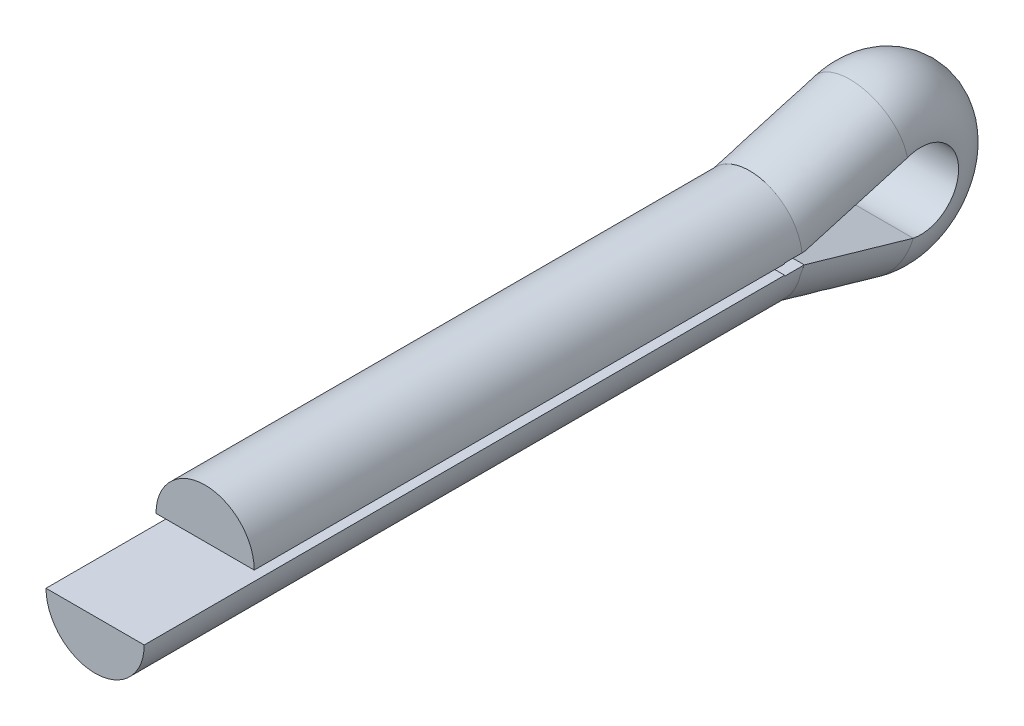
ISO-10303-21;
HEADER;
FILE_DESCRIPTION(('STEP AP214'),'2;1');
FILE_NAME('part.step','',(''),(''),'','','');
FILE_SCHEMA(('AUTOMOTIVE_DESIGN { 1 0 10303 214 1 1 1 1 }'));
ENDSEC;
DATA;
#1=APPLICATION_CONTEXT('core data for automotive mechanical design processes');
#2=APPLICATION_PROTOCOL_DEFINITION('international standard','automotive_design',2000,#1);
#3=PRODUCT_CONTEXT('',#1,'mechanical');
#4=PRODUCT('Part','Part','',(#3));
#5=PRODUCT_RELATED_PRODUCT_CATEGORY('part','',(#4));
#6=PRODUCT_DEFINITION_FORMATION('','',#4);
#7=PRODUCT_DEFINITION_CONTEXT('part definition',#1,'design');
#8=PRODUCT_DEFINITION('design','',#6,#7);
#9=PRODUCT_DEFINITION_SHAPE('','',#8);
#10=(LENGTH_UNIT() NAMED_UNIT(*) SI_UNIT(.MILLI.,.METRE.));
#11=(NAMED_UNIT(*) PLANE_ANGLE_UNIT() SI_UNIT($,.RADIAN.));
#12=(NAMED_UNIT(*) SI_UNIT($,.STERADIAN.) SOLID_ANGLE_UNIT());
#13=UNCERTAINTY_MEASURE_WITH_UNIT(LENGTH_MEASURE(1.E-05),#10,'distance_accuracy_value','');
#14=(GEOMETRIC_REPRESENTATION_CONTEXT(3) GLOBAL_UNCERTAINTY_ASSIGNED_CONTEXT((#13)) GLOBAL_UNIT_ASSIGNED_CONTEXT((#10,
#11,#12)) REPRESENTATION_CONTEXT('',''));
#15=CARTESIAN_POINT('',(0.,0.,0.));
#16=DIRECTION('',(0.,0.,1.));
#17=DIRECTION('',(1.,0.,0.));
#18=AXIS2_PLACEMENT_3D('',#15,#16,#17);
#19=CARTESIAN_POINT('',(2.5,0.25,33.));
#20=DIRECTION('',(0.,0.,-1.));
#21=DIRECTION('',(-1.,0.,0.));
#22=AXIS2_PLACEMENT_3D('',#19,#20,#21);
#23=PLANE('',#22);
#24=CARTESIAN_POINT('',(2.5,0.25,33.));
#25=DIRECTION('',(0.,0.,1.));
#26=DIRECTION('',(-1.,0.,0.));
#27=AXIS2_PLACEMENT_3D('',#24,#25,#26);
#28=CIRCLE('',#27,2.5);
#29=CARTESIAN_POINT('',(5.,0.25,33.));
#30=VERTEX_POINT('',#29);
#31=CARTESIAN_POINT('',(0.,0.25,33.));
#32=VERTEX_POINT('',#31);
#33=EDGE_CURVE('E208',#30,#32,#28,.T.);
#34=ORIENTED_EDGE('',*,*,#33,.T.);
#35=DIRECTION('',(1.,0.,0.));
#36=VECTOR('',#35,1.);
#37=CARTESIAN_POINT('',(5.,0.25,33.));
#38=LINE('',#37,#36);
#39=EDGE_CURVE('E211',#32,#30,#38,.T.);
#40=ORIENTED_EDGE('',*,*,#39,.T.);
#41=EDGE_LOOP('',(#34,#40));
#42=FACE_BOUND('',#41,.T.);
#43=ADVANCED_FACE('F32',(#42),#23,.F.);
#44=CARTESIAN_POINT('',(2.5,-0.25,38.6));
#45=DIRECTION('',(0.,0.,-1.));
#46=DIRECTION('',(-1.,0.,0.));
#47=AXIS2_PLACEMENT_3D('',#44,#45,#46);
#48=PLANE('',#47);
#49=CARTESIAN_POINT('',(2.5,-0.25,38.6));
#50=DIRECTION('',(0.,0.,1.));
#51=DIRECTION('',(-1.,0.,0.));
#52=AXIS2_PLACEMENT_3D('',#49,#50,#51);
#53=CIRCLE('',#52,2.5);
#54=CARTESIAN_POINT('',(0.,-0.25,38.6));
#55=VERTEX_POINT('',#54);
#56=CARTESIAN_POINT('',(5.,-0.25,38.6));
#57=VERTEX_POINT('',#56);
#58=EDGE_CURVE('E196',#55,#57,#53,.T.);
#59=ORIENTED_EDGE('',*,*,#58,.T.);
#60=DIRECTION('',(-1.,0.,0.));
#61=VECTOR('',#60,1.);
#62=CARTESIAN_POINT('',(0.,-0.25,38.6));
#63=LINE('',#62,#61);
#64=EDGE_CURVE('E199',#57,#55,#63,.T.);
#65=ORIENTED_EDGE('',*,*,#64,.T.);
#66=EDGE_LOOP('',(#59,#65));
#67=FACE_BOUND('',#66,.T.);
#68=ADVANCED_FACE('F374',(#67),#48,.F.);
#69=CARTESIAN_POINT('',(0.,-0.00250000000000052,-0.92984556307093));
#70=DIRECTION('',(1.,0.,0.));
#71=DIRECTION('',(0.,0.,-1.));
#72=AXIS2_PLACEMENT_3D('',#69,#70,#71);
#73=CYLINDRICAL_SURFACE('',#72,1.92699345379873);
#74=DIRECTION('',(-1.,0.,0.));
#75=VECTOR('',#74,1.);
#76=CARTESIAN_POINT('',(3.64631078803518E-06,1.80107771620032,-0.251309497258058));
#77=LINE('',#76,#75);
#78=CARTESIAN_POINT('',(4.99999635368921,1.80107771620032,-0.251309497258058));
#79=VERTEX_POINT('',#78);
#80=CARTESIAN_POINT('',(3.64631078803518E-06,1.80107771620032,-0.251309497258058));
#81=VERTEX_POINT('',#80);
#82=EDGE_CURVE('E180',#79,#81,#77,.T.);
#83=ORIENTED_EDGE('',*,*,#82,.T.);
#84=CARTESIAN_POINT('',(3.64631078803518E-06,-0.00250000000000052,-0.92984556307093));
#85=DIRECTION('',(1.,0.,0.));
#86=DIRECTION('',(0.,-0.979876555360371,0.199604449487211));
#87=AXIS2_PLACEMENT_3D('',#84,#85,#86);
#88=CIRCLE('',#87,1.92699345379874);
#89=CARTESIAN_POINT('',(3.64631078803518E-06,-1.89071570771029,-0.545209095559971));
#90=VERTEX_POINT('',#89);
#91=EDGE_CURVE('E190',#90,#81,#88,.T.);
#92=ORIENTED_EDGE('',*,*,#91,.F.);
#93=DIRECTION('',(-1.,0.,0.));
#94=VECTOR('',#93,1.);
#95=CARTESIAN_POINT('',(3.64631078803518E-06,-1.89071570771029,-0.545209095559973));
#96=LINE('',#95,#94);
#97=CARTESIAN_POINT('',(4.99999635368921,-1.89071570771029,-0.545209095559971));
#98=VERTEX_POINT('',#97);
#99=EDGE_CURVE('E188',#98,#90,#96,.T.);
#100=ORIENTED_EDGE('',*,*,#99,.F.);
#101=CARTESIAN_POINT('',(4.99999635368921,-0.00250000000000052,-0.92984556307093));
#102=DIRECTION('',(1.,0.,0.));
#103=DIRECTION('',(0.,-0.979876555360372,0.199604449487211));
#104=AXIS2_PLACEMENT_3D('',#101,#102,#103);
#105=CIRCLE('',#104,1.92699345379873);
#106=EDGE_CURVE('E184',#98,#79,#105,.T.);
#107=ORIENTED_EDGE('',*,*,#106,.T.);
#108=EDGE_LOOP('',(#83,#92,#100,#107));
#109=FACE_BOUND('',#108,.T.);
#110=ADVANCED_FACE('F319',(#109),#73,.F.);
#111=CARTESIAN_POINT('',(0.,-0.249999999999999,5.34225564062762));
#112=DIRECTION('',(0.,-1.,0.));
#113=DIRECTION('',(1.,0.,0.));
#114=AXIS2_PLACEMENT_3D('',#111,#112,#113);
#115=PLANE('',#114);
#116=DIRECTION('',(1.,0.,0.));
#117=VECTOR('',#116,1.);
#118=CARTESIAN_POINT('',(0.,-0.249999999999999,6.));
#119=LINE('',#118,#117);
#120=CARTESIAN_POINT('',(0.,-0.249999999999999,6.));
#121=VERTEX_POINT('',#120);
#122=CARTESIAN_POINT('',(5.,-0.25,6.));
#123=VERTEX_POINT('',#122);
#124=EDGE_CURVE('E11',#121,#123,#119,.T.);
#125=ORIENTED_EDGE('',*,*,#124,.F.);
#126=DIRECTION('',(0.,0.,-1.));
#127=VECTOR('',#126,1.);
#128=CARTESIAN_POINT('',(0.,-0.249999999999999,5.34225564062762));
#129=LINE('',#128,#127);
#130=EDGE_CURVE('E202',#55,#121,#129,.T.);
#131=ORIENTED_EDGE('',*,*,#130,.F.);
#132=ORIENTED_EDGE('',*,*,#64,.F.);
#133=DIRECTION('',(0.,0.,-1.));
#134=VECTOR('',#133,1.);
#135=CARTESIAN_POINT('',(5.,-0.25,5.34225564062762));
#136=LINE('',#135,#134);
#137=EDGE_CURVE('E205',#57,#123,#136,.T.);
#138=ORIENTED_EDGE('',*,*,#137,.T.);
#139=EDGE_LOOP('',(#125,#131,#132,#138));
#140=FACE_BOUND('',#139,.T.);
#141=ADVANCED_FACE('F384',(#140),#115,.F.);
#142=CARTESIAN_POINT('',(2.5,-0.285495836964904,5.01369655478465));
#143=DIRECTION('',(0.,0.37672498224056,0.926325152285012));
#144=DIRECTION('',(0.,-0.926325152285012,0.37672498224056));
#145=AXIS2_PLACEMENT_3D('',#142,#143,#144);
#146=PLANE('',#145);
#147=DIRECTION('',(1.,0.,0.));
#148=VECTOR('',#147,1.);
#149=CARTESIAN_POINT('',(2.5,-0.293791577623972,5.01707032990535));
#150=LINE('',#149,#148);
#151=CARTESIAN_POINT('',(1.65391023472169E-05,-0.293791577623972,5.01707032990535));
#152=VERTEX_POINT('',#151);
#153=CARTESIAN_POINT('',(0.000383569879330858,-0.293791577623972,5.01707032990535));
#154=VERTEX_POINT('',#153);
#155=EDGE_CURVE('E41',#152,#154,#150,.T.);
#156=ORIENTED_EDGE('',*,*,#155,.F.);
#157=CARTESIAN_POINT('',(2.5,-0.285495836964904,5.01369655478465));
#158=DIRECTION('',(0.,0.37672498224056,0.926325152285012));
#159=DIRECTION('',(-1.,0.,0.));
#160=AXIS2_PLACEMENT_3D('',#157,#158,#159);
#161=ELLIPSE('',#160,2.5,2.46201938253052);
#162=CARTESIAN_POINT('',(0.0329445270113847,-0.654521066446691,5.1637745513498));
#163=VERTEX_POINT('',#162);
#164=EDGE_CURVE('E302',#152,#163,#161,.T.);
#165=ORIENTED_EDGE('',*,*,#164,.T.);
#166=CARTESIAN_POINT('',(2.5,-0.25,4.99926083691902));
#167=DIRECTION('',(0.,0.37672498224056,0.926325152285012));
#168=DIRECTION('',(0.,0.926325152285012,-0.37672498224056));
#169=AXIS2_PLACEMENT_3D('',#166,#167,#168);
#170=ELLIPSE('',#169,2.69883635765814,2.5);
#171=EDGE_CURVE('E225',#154,#163,#170,.T.);
#172=ORIENTED_EDGE('',*,*,#171,.F.);
#173=EDGE_LOOP('',(#156,#165,#172));
#174=FACE_BOUND('',#173,.T.);
#175=ADVANCED_FACE('F251',(#174),#146,.T.);
#176=CARTESIAN_POINT('',(3.64631078803024E-06,-0.289391008613093,5.01528067291678));
#177=CARTESIAN_POINT('',(3.64631078803024E-06,-1.89071570771029,-0.545209095559975));
#178=CARTESIAN_POINT('',(0.0085142443796971,-4.8351110612692,6.86396879488255));
#179=CARTESIAN_POINT('',(0.0085142443796971,-6.4364357603664,1.30347902640579));
#180=CARTESIAN_POINT('',(4.99148575562031,-4.8351110612692,6.86396879488255));
#181=CARTESIAN_POINT('',(4.99148575562031,-6.4364357603664,1.30347902640579));
#182=CARTESIAN_POINT('',(4.99999635368921,-0.289391008613092,5.01528067291678));
#183=CARTESIAN_POINT('',(4.99999635368921,-1.89071570771029,-0.545209095559975));
#184=(BOUNDED_SURFACE() B_SPLINE_SURFACE(3,1,((#176,#177),(#178,#179),(#180,#181),(#182,#183)),
.UNSPECIFIED.,.F.,.F.,.F.) B_SPLINE_SURFACE_WITH_KNOTS((4,4),(2,2),(0.,1.),(0.,1.),
.UNSPECIFIED.) GEOMETRIC_REPRESENTATION_ITEM() RATIONAL_B_SPLINE_SURFACE(((1.,1.),
(0.334471957552464,0.334471957552464),(0.334471957552464,0.334471957552464),(1.,1.))) REPRESENTATION_ITEM('') SURFACE());
#185=CARTESIAN_POINT('',(1.65391023470866E-05,-0.293791577623971,5.01707032990535));
#186=CARTESIAN_POINT('',(1.22415051607345E-05,-0.293791577623971,5.0113802199369));
#187=CARTESIAN_POINT('',(7.94390797438236E-06,-0.293791577623971,5.00569010996845));
#188=CARTESIAN_POINT('',(3.64631078803024E-06,-0.293791577623971,5.));
#189=B_SPLINE_CURVE_WITH_KNOTS('',3,(#185,#186,#187,#188),.UNSPECIFIED.,.F.,.F.,(4,4),(0.,
0.0170703347741464),.UNSPECIFIED.);
#190=CARTESIAN_POINT('',(3.64631078803024E-06,-0.293791577623972,5.));
#191=VERTEX_POINT('',#190);
#192=EDGE_CURVE('E56',#152,#191,#189,.T.);
#193=DIRECTION('',(0.,-0.276735808007553,-0.960946040403105));
#194=VECTOR('',#193,1.);
#195=CARTESIAN_POINT('',(3.64631078803518E-06,-0.289391008613092,5.01528067291678));
#196=LINE('',#195,#194);
#197=EDGE_CURVE('E304',#191,#90,#196,.T.);
#198=CARTESIAN_POINT('',(2.5,-1.8868205360621,-0.546793213692108));
#199=DIRECTION('',(0.,0.37672498224056,0.926325152285012));
#200=DIRECTION('',(-1.,0.,0.));
#201=AXIS2_PLACEMENT_3D('',#198,#199,#200);
#202=ELLIPSE('',#201,2.5,2.46201938253052);
#203=EDGE_CURVE('E306',#90,#98,#202,.T.);
#204=DIRECTION('',(0.,-0.276735808007553,-0.960946040403105));
#205=VECTOR('',#204,1.);
#206=CARTESIAN_POINT('',(4.99999635368921,-0.289391008613092,5.01528067291678));
#207=LINE('',#206,#205);
#208=CARTESIAN_POINT('',(4.99999635368921,-0.293791577623972,5.));
#209=VERTEX_POINT('',#208);
#210=EDGE_CURVE('E191',#209,#98,#207,.T.);
#211=CARTESIAN_POINT('',(4.99999635368921,-0.293791577623972,5.));
#212=CARTESIAN_POINT('',(4.99999205609203,-0.293791577623972,5.00569010996845));
#213=CARTESIAN_POINT('',(4.99998775849484,-0.293791577623972,5.0113802199369));
#214=CARTESIAN_POINT('',(4.99998346089765,-0.293791577623972,5.01707032990535));
#215=B_SPLINE_CURVE_WITH_KNOTS('',3,(#211,#212,#213,#214),.UNSPECIFIED.,.F.,.F.,(4,4),(0.,
0.0170703347741524),.UNSPECIFIED.);
#216=CARTESIAN_POINT('',(4.99998346089765,-0.293791577623972,5.01707032990535));
#217=VERTEX_POINT('',#216);
#218=EDGE_CURVE('E283',#209,#217,#215,.T.);
#219=CARTESIAN_POINT('',(4.96705547297769,-0.654521066510559,5.16377455137577));
#220=VERTEX_POINT('',#219);
#221=EDGE_CURVE('E305',#220,#217,#161,.T.);
#222=CARTESIAN_POINT('',(4.96705547297769,-0.654521066510559,5.16377455137577));
#223=CARTESIAN_POINT('',(4.95567241823373,-0.723984114533118,5.16838019162372));
#224=CARTESIAN_POINT('',(4.94134276240962,-0.792963031017594,5.17295373257438));
#225=CARTESIAN_POINT('',(4.90692029657588,-0.929471143715911,5.18200469310625));
#226=CARTESIAN_POINT('',(4.88682771998184,-0.997000398526363,5.1864821165726));
#227=CARTESIAN_POINT('',(4.84102284634058,-1.1300918006837,5.19530653707777));
#228=CARTESIAN_POINT('',(4.81531407197679,-1.1956551519311,5.19965361393962));
#229=CARTESIAN_POINT('',(4.75846830274177,-1.32437326086863,5.20818806983407));
#230=CARTESIAN_POINT('',(4.72733138307606,-1.38752805191396,5.21237545107824));
#231=CARTESIAN_POINT('',(4.62604201135939,-1.57276610970813,5.22465737543485));
#232=CARTESIAN_POINT('',(4.54799320351442,-1.69067447994353,5.23247510841774));
#233=CARTESIAN_POINT('',(4.37319527105292,-1.91162804159334,5.24712509414793));
#234=CARTESIAN_POINT('',(4.2764502683548,-2.01467650041891,5.25395756353592));
#235=CARTESIAN_POINT('',(4.06708980713622,-2.20294906343133,5.26644068596328));
#236=CARTESIAN_POINT('',(3.95449590912986,-2.28819699818291,5.2720929190515));
#237=CARTESIAN_POINT('',(3.71652246377559,-2.43858201816375,5.28206396629728));
#238=CARTESIAN_POINT('',(3.59114108779508,-2.50371622171361,5.28638258938952));
#239=CARTESIAN_POINT('',(3.33145952698625,-2.61186683669086,5.2935533494209));
#240=CARTESIAN_POINT('',(3.19717938782545,-2.65493117105062,5.2964086638163));
#241=CARTESIAN_POINT('',(2.92327719488159,-2.71790958635169,5.30058435069096));
#242=CARTESIAN_POINT('',(2.78365552081988,-2.73782530974449,5.30190483207045));
#243=CARTESIAN_POINT('',(2.50327963711892,-2.75393472283625,5.30297294190525));
#244=CARTESIAN_POINT('',(2.36252749973498,-2.75016485216041,5.30272298643381));
#245=CARTESIAN_POINT('',(2.08358415799827,-2.71906121466856,5.3006607076329));
#246=CARTESIAN_POINT('',(1.94539300006523,-2.69172702115678,5.29884835601202));
#247=CARTESIAN_POINT('',(1.74317517549754,-2.63372781614348,5.29500280801013));
#248=CARTESIAN_POINT('',(1.67659108019728,-2.61155075452791,5.29353239207993));
#249=CARTESIAN_POINT('',(1.54552715224032,-2.56168542868084,5.29022614841642));
#250=CARTESIAN_POINT('',(1.48104683938915,-2.53399843249715,5.28839040475907));
#251=CARTESIAN_POINT('',(1.35467738085909,-2.4733189902773,5.2843671477569));
#252=CARTESIAN_POINT('',(1.29278718657798,-2.44032871796455,5.28217977853747));
#253=CARTESIAN_POINT('',(1.1719585397037,-2.36925197887974,5.27746714476811));
#254=CARTESIAN_POINT('',(1.11302296887799,-2.3311606648234,5.27494155882646));
#255=CARTESIAN_POINT('',(0.941304217477466,-2.20961834223705,5.2668828822487));
#256=CARTESIAN_POINT('',(0.833578476131577,-2.11888426132675,5.26086689873178));
#257=CARTESIAN_POINT('',(0.634913667593598,-1.92067111485626,5.24772468119815));
#258=CARTESIAN_POINT('',(0.543974306303606,-1.81319234272443,5.24059846663674));
#259=CARTESIAN_POINT('',(0.421967668924477,-1.64167050474795,5.22922597519885));
#260=CARTESIAN_POINT('',(0.38363723267911,-1.58265123496358,5.22531279337132));
#261=CARTESIAN_POINT('',(0.312110135254634,-1.4616383109568,5.21728921776021));
#262=CARTESIAN_POINT('',(0.278909272439559,-1.39964714614349,5.21317898903307));
#263=CARTESIAN_POINT('',(0.21787830627098,-1.27315700694837,5.20479225507828));
#264=CARTESIAN_POINT('',(0.190043712867503,-1.20866018386939,5.20051589248951));
#265=CARTESIAN_POINT('',(0.139905726492922,-1.07757265712972,5.19182433581412));
#266=CARTESIAN_POINT('',(0.117600915414544,-1.01098249524989,5.18740917764944));
#267=CARTESIAN_POINT('',(0.0844147087549483,-0.896061563483938,5.1797895221893));
#268=CARTESIAN_POINT('',(0.0721042421252022,-0.848136375512617,5.17661191637997));
#269=CARTESIAN_POINT('',(0.0503656772983729,-0.751727396289004,5.17021966742914));
#270=CARTESIAN_POINT('',(0.040932587098048,-0.703244725670459,5.16700509858954));
#271=CARTESIAN_POINT('',(0.0329445270223038,-0.654521066510488,5.16377455137575));
#272=B_SPLINE_CURVE_WITH_KNOTS('',3,(#222,#223,#224,#225,#226,#227,#228,#229,#230,#231,#232,
#233,#234,#235,#236,#237,#238,#239,#240,#241,#242,#243,#244,#245,#246,#247,#248,#249,#250,#251,
#252,#253,#254,#255,#256,#257,#258,#259,#260,#261,#262,#263,#264,#265,#266,#267,#268,#269,#270,
#271),.UNSPECIFIED.,.F.,.F.,(4,2,2,2,2,2,2,2,2,2,2,2,2,2,2,2,2,2,2,2,2,2,2,2,4),(0.,
0.211551722946237,0.423094878621574,0.634505725779943,0.845913644129274,1.26856803893243,
1.69112935792325,2.11312129100429,2.53517365453812,2.95630564064038,3.377407744557,
3.79786215344868,4.21832417596416,4.42870616424123,4.63903979140822,4.8492874251677,
5.0597362843058,5.48053363152893,5.90132360566957,6.11256273670408,6.32362791372768,
6.53451571504861,6.74534937832574,6.89401626195437,7.04242373464624),.UNSPECIFIED.);
#273=EDGE_CURVE('E228',#220,#163,#272,.T.);
#274=ORIENTED_EDGE('',*,*,#164,.F.);
#275=ORIENTED_EDGE('',*,*,#192,.T.);
#276=ORIENTED_EDGE('',*,*,#197,.T.);
#277=ORIENTED_EDGE('',*,*,#203,.T.);
#278=ORIENTED_EDGE('',*,*,#210,.F.);
#279=ORIENTED_EDGE('',*,*,#218,.T.);
#280=ORIENTED_EDGE('',*,*,#221,.F.);
#281=ORIENTED_EDGE('',*,*,#273,.T.);
#282=EDGE_LOOP('',(#274,#275,#276,#277,#278,#279,#280,#281));
#283=FACE_BOUND('',#282,.T.);
#284=ADVANCED_FACE('F243',(#283),#184,.F.);
#285=DIRECTION('',(1.,0.,0.));
#286=VECTOR('',#285,1.);
#287=CARTESIAN_POINT('',(2.5,-0.293791577623972,5.01707032990535));
#288=LINE('',#287,#286);
#289=CARTESIAN_POINT('',(4.99961643012067,-0.293791577623972,5.01707032990535));
#290=VERTEX_POINT('',#289);
#291=EDGE_CURVE('E289',#290,#217,#288,.T.);
#292=ORIENTED_EDGE('',*,*,#291,.F.);
#293=EDGE_CURVE('E229',#220,#290,#170,.T.);
#294=ORIENTED_EDGE('',*,*,#293,.F.);
#295=ORIENTED_EDGE('',*,*,#221,.T.);
#296=EDGE_LOOP('',(#292,#294,#295));
#297=FACE_BOUND('',#296,.T.);
#298=ADVANCED_FACE('F250',(#297),#146,.T.);
#299=CARTESIAN_POINT('',(3.64631078803518E-06,-0.289391008613092,5.01528067291678));
#300=DIRECTION('',(0.,-0.960946040403105,0.276735808007553));
#301=DIRECTION('',(0.,-0.276735808007553,-0.960946040403105));
#302=AXIS2_PLACEMENT_3D('',#299,#300,#301);
#303=PLANE('',#302);
#304=ORIENTED_EDGE('',*,*,#197,.F.);
#305=DIRECTION('',(1.,0.,0.));
#306=VECTOR('',#305,1.);
#307=CARTESIAN_POINT('',(2.5,-0.293791577623971,5.));
#308=LINE('',#307,#306);
#309=EDGE_CURVE('E160',#191,#209,#308,.T.);
#310=ORIENTED_EDGE('',*,*,#309,.T.);
#311=ORIENTED_EDGE('',*,*,#210,.T.);
#312=ORIENTED_EDGE('',*,*,#99,.T.);
#313=EDGE_LOOP('',(#304,#310,#311,#312));
#314=FACE_BOUND('',#313,.T.);
#315=ADVANCED_FACE('F322',(#314),#303,.F.);
#316=CARTESIAN_POINT('',(2.5,-0.25,5.31804017000262));
#317=DIRECTION('',(0.,0.,-1.));
#318=DIRECTION('',(-1.,0.,0.));
#319=AXIS2_PLACEMENT_3D('',#316,#317,#318);
#320=CYLINDRICAL_SURFACE('',#319,2.5);
#321=ORIENTED_EDGE('',*,*,#293,.T.);
#322=DIRECTION('',(0.,0.,-1.));
#323=VECTOR('',#322,1.);
#324=CARTESIAN_POINT('',(4.99961643012067,-0.293791577623972,5.31804017000262));
#325=LINE('',#324,#323);
#326=CARTESIAN_POINT('',(4.99961643012067,-0.293791577623972,6.));
#327=VERTEX_POINT('',#326);
#328=EDGE_CURVE('E291',#290,#327,#325,.F.);
#329=ORIENTED_EDGE('',*,*,#328,.T.);
#330=CARTESIAN_POINT('',(2.5,-0.25,6.));
#331=DIRECTION('',(0.,0.,-1.));
#332=DIRECTION('',(-1.,0.,0.));
#333=AXIS2_PLACEMENT_3D('',#330,#331,#332);
#334=CIRCLE('',#333,2.5);
#335=EDGE_CURVE('E296',#123,#327,#334,.T.);
#336=ORIENTED_EDGE('',*,*,#335,.F.);
#337=ORIENTED_EDGE('',*,*,#137,.F.);
#338=ORIENTED_EDGE('',*,*,#58,.F.);
#339=ORIENTED_EDGE('',*,*,#130,.T.);
#340=CARTESIAN_POINT('',(0.000383569879330425,-0.293791577623972,6.));
#341=VERTEX_POINT('',#340);
#342=EDGE_CURVE('E294',#341,#121,#334,.T.);
#343=ORIENTED_EDGE('',*,*,#342,.F.);
#344=DIRECTION('',(0.,0.,-1.));
#345=VECTOR('',#344,1.);
#346=CARTESIAN_POINT('',(0.000383569879330425,-0.293791577623972,5.31804017000262));
#347=LINE('',#346,#345);
#348=EDGE_CURVE('E272',#341,#154,#347,.T.);
#349=ORIENTED_EDGE('',*,*,#348,.T.);
#350=ORIENTED_EDGE('',*,*,#171,.T.);
#351=ORIENTED_EDGE('',*,*,#273,.F.);
#352=EDGE_LOOP('',(#321,#329,#336,#337,#338,#339,#343,#349,#350,#351));
#353=FACE_BOUND('',#352,.T.);
#354=ADVANCED_FACE('F240',(#353),#320,.T.);
#355=CARTESIAN_POINT('',(3.64631078803024E-06,-1.89071570771029,-0.545209095559974));
#356=CARTESIAN_POINT('',(3.64631078803024E-06,-2.1697497911316,-1.9150130112213));
#357=CARTESIAN_POINT('',(3.64631078803024E-06,-1.2431043623042,-2.96169875025913));
#358=CARTESIAN_POINT('',(3.64631078803024E-06,0.150422009116469,-2.8507616544479));
#359=CARTESIAN_POINT('',(3.64631078803024E-06,1.54394838053713,-2.73982455863666));
#360=CARTESIAN_POINT('',(3.64631078803024E-06,2.29332092552888,-1.55971287922472));
#361=CARTESIAN_POINT('',(3.64631078803024E-06,1.80107771620032,-0.251309497258056));
#362=CARTESIAN_POINT('',(0.0085142443796971,-6.4364357603664,1.30347902640579));
#363=CARTESIAN_POINT('',(0.0085142443796971,-8.05659851778655,-3.36401227857363));
#364=CARTESIAN_POINT('',(0.0085142443796971,-5.30166834779317,-7.46532453211518));
#365=CARTESIAN_POINT('',(0.0085142443796971,-0.368104009878862,-7.73055154101494));
#366=CARTESIAN_POINT('',(0.0085142443796971,4.56546032803545,-7.9957785499147));
#367=CARTESIAN_POINT('',(0.0085142443796971,7.74421227193543,-4.21345935109742));
#368=CARTESIAN_POINT('',(0.0085142443796971,6.63378720253565,0.60082757510861));
#369=CARTESIAN_POINT('',(4.99148575562031,-6.4364357603664,1.30347902640579));
#370=CARTESIAN_POINT('',(4.99148575562031,-8.05659851778655,-3.36401227857363));
#371=CARTESIAN_POINT('',(4.99148575562031,-5.30166834779317,-7.46532453211518));
#372=CARTESIAN_POINT('',(4.99148575562031,-0.368104009878862,-7.73055154101494));
#373=CARTESIAN_POINT('',(4.99148575562031,4.56546032803545,-7.9957785499147));
#374=CARTESIAN_POINT('',(4.99148575562031,7.74421227193543,-4.21345935109742));
#375=CARTESIAN_POINT('',(4.99148575562031,6.63378720253565,0.60082757510861));
#376=CARTESIAN_POINT('',(4.99999635368921,-1.89071570771029,-0.545209095559974));
#377=CARTESIAN_POINT('',(4.99999635368921,-2.16974979113159,-1.9150130112213));
#378=CARTESIAN_POINT('',(4.99999635368921,-1.2431043623042,-2.96169875025913));
#379=CARTESIAN_POINT('',(4.99999635368921,0.150422009116468,-2.8507616544479));
#380=CARTESIAN_POINT('',(4.99999635368921,1.54394838053713,-2.73982455863666));
#381=CARTESIAN_POINT('',(4.99999635368921,2.29332092552888,-1.55971287922472));
#382=CARTESIAN_POINT('',(4.99999635368921,1.80107771620032,-0.251309497258057));
#383=(BOUNDED_SURFACE() B_SPLINE_SURFACE(3,3,((#355,#356,#357,#358,#359,#360,#361),(#362,#363,
#364,#365,#366,#367,#368),(#369,#370,#371,#372,#373,#374,#375),(#376,#377,#378,#379,#380,#381,
#382)),.UNSPECIFIED.,.F.,.F.,.F.) B_SPLINE_SURFACE_WITH_KNOTS((4,4),(4,3,4),(0.,1.),(0.,0.5,1.),
.UNSPECIFIED.) GEOMETRIC_REPRESENTATION_ITEM() RATIONAL_B_SPLINE_SURFACE(((1.,0.734239027977749,
0.734239027977749,1.,0.734239027977749,0.734239027977749,1.),(0.334471957552464,
0.245582364999136,0.245582364999136,0.334471957552464,0.245582364999136,0.245582364999136,
0.334471957552464),(0.334471957552464,0.245582364999136,0.245582364999136,0.334471957552464,
0.245582364999136,0.245582364999136,0.334471957552464),(1.,0.734239027977749,0.734239027977749,
1.,0.734239027977749,0.734239027977749,1.))) REPRESENTATION_ITEM('') SURFACE());
#384=CARTESIAN_POINT('',(2.5,1.79693662683339,-0.252039683042973));
#385=DIRECTION('',(0.,0.173648177666931,-0.984807753012208));
#386=DIRECTION('',(-1.,0.,0.));
#387=AXIS2_PLACEMENT_3D('',#384,#385,#386);
#388=ELLIPSE('',#387,2.5,2.46201938253052);
#389=EDGE_CURVE('E178',#81,#79,#388,.T.);
#390=ORIENTED_EDGE('',*,*,#106,.F.);
#391=ORIENTED_EDGE('',*,*,#203,.F.);
#392=ORIENTED_EDGE('',*,*,#91,.T.);
#393=ORIENTED_EDGE('',*,*,#389,.T.);
#394=EDGE_LOOP('',(#390,#391,#392,#393));
#395=FACE_BOUND('',#394,.T.);
#396=ADVANCED_FACE('F255',(#395),#383,.F.);
#397=CARTESIAN_POINT('',(5.,0.25,33.));
#398=DIRECTION('',(0.,1.,0.));
#399=DIRECTION('',(-1.,0.,0.));
#400=AXIS2_PLACEMENT_3D('',#397,#398,#399);
#401=PLANE('',#400);
#402=DIRECTION('',(-1.,0.,0.));
#403=VECTOR('',#402,1.);
#404=CARTESIAN_POINT('',(5.,0.25,6.));
#405=LINE('',#404,#403);
#406=CARTESIAN_POINT('',(5.,0.25,6.));
#407=VERTEX_POINT('',#406);
#408=CARTESIAN_POINT('',(0.,0.25,6.));
#409=VERTEX_POINT('',#408);
#410=EDGE_CURVE('E297',#407,#409,#405,.T.);
#411=ORIENTED_EDGE('',*,*,#410,.F.);
#412=DIRECTION('',(0.,0.,-1.));
#413=VECTOR('',#412,1.);
#414=CARTESIAN_POINT('',(5.,0.25,33.));
#415=LINE('',#414,#413);
#416=EDGE_CURVE('E213',#30,#407,#415,.T.);
#417=ORIENTED_EDGE('',*,*,#416,.F.);
#418=ORIENTED_EDGE('',*,*,#39,.F.);
#419=DIRECTION('',(0.,0.,-1.));
#420=VECTOR('',#419,1.);
#421=CARTESIAN_POINT('',(0.,0.25,33.));
#422=LINE('',#421,#420);
#423=EDGE_CURVE('E216',#32,#409,#422,.T.);
#424=ORIENTED_EDGE('',*,*,#423,.T.);
#425=EDGE_LOOP('',(#411,#417,#418,#424));
#426=FACE_BOUND('',#425,.T.);
#427=ADVANCED_FACE('F386',(#426),#401,.F.);
#428=CARTESIAN_POINT('',(3.64631078803024E-06,1.80107771620032,-0.251309497258054));
#429=CARTESIAN_POINT('',(3.64631078803024E-06,0.199753017103123,5.3091802712187));
#430=CARTESIAN_POINT('',(0.0085142443796971,6.63378720253565,0.600827575108614));
#431=CARTESIAN_POINT('',(0.0085142443796971,5.03246250343846,6.16131734358537));
#432=CARTESIAN_POINT('',(4.99148575562031,6.63378720253565,0.600827575108614));
#433=CARTESIAN_POINT('',(4.99148575562031,5.03246250343845,6.16131734358537));
#434=CARTESIAN_POINT('',(4.99999635368921,1.80107771620032,-0.251309497258054));
#435=CARTESIAN_POINT('',(4.99999635368921,0.199753017103122,5.3091802712187));
#436=(BOUNDED_SURFACE() B_SPLINE_SURFACE(3,1,((#428,#429),(#430,#431),(#432,#433),(#434,#435)),
.UNSPECIFIED.,.F.,.F.,.F.) B_SPLINE_SURFACE_WITH_KNOTS((4,4),(2,2),(0.,1.),(0.,1.),
.UNSPECIFIED.) GEOMETRIC_REPRESENTATION_ITEM() RATIONAL_B_SPLINE_SURFACE(((1.,1.),
(0.334471957552464,0.334471957552464),(0.334471957552464,0.334471957552464),(1.,1.))) REPRESENTATION_ITEM('') SURFACE());
#437=CARTESIAN_POINT('',(0.000152470521040788,0.222389687471128,5.31317172695799));
#438=CARTESIAN_POINT('',(0.000139636673718746,0.223551669216312,5.30502503736654));
#439=CARTESIAN_POINT('',(0.000127613307608126,0.224713618603548,5.29687834073286));
#440=CARTESIAN_POINT('',(0.000105182014939527,0.227038040275013,5.28058128012196));
#441=CARTESIAN_POINT('',(9.47748175883041E-05,0.228200512559307,5.27243091614375));
#442=CARTESIAN_POINT('',(7.55797050145503E-05,0.23052578651191,5.25612834492158));
#443=CARTESIAN_POINT('',(6.67921584657575E-05,0.231688588195019,5.24797613767982));
#444=CARTESIAN_POINT('',(5.06608223476743E-05,0.234040085479069,5.23148831053749));
#445=CARTESIAN_POINT('',(4.33539524493457E-05,0.23522877521958,5.22315268955531));
#446=CARTESIAN_POINT('',(3.04365057798715E-05,0.237606882818505,5.20648351902343));
#447=CARTESIAN_POINT('',(2.48255438348236E-05,0.238796300450014,5.19814996943355));
#448=CARTESIAN_POINT('',(1.53056787580195E-05,0.241170869678642,5.18148603725694));
#449=CARTESIAN_POINT('',(1.13959942102732E-05,0.242356022985813,5.17315565497585));
#450=CARTESIAN_POINT('',(7.18188176780366E-06,0.243992049525313,5.16172470499479));
#451=CARTESIAN_POINT('',(6.15474328200218E-06,0.244436949523646,5.15862307144506));
#452=CARTESIAN_POINT('',(4.34952025494797E-06,0.245313899020764,5.15241795000262));
#453=CARTESIAN_POINT('',(3.57140132894885E-06,0.245745950286229,5.14931446242524));
#454=CARTESIAN_POINT('',(2.15817239558397E-06,0.246684617930076,5.14313348895131));
#455=CARTESIAN_POINT('',(1.5224629350804E-06,0.2471909063202,5.14005594862566));
#456=CARTESIAN_POINT('',(4.80160774619645E-07,0.248333588566182,5.13392658176987));
#457=CARTESIAN_POINT('',(7.29752146665126E-08,0.248969639870689,5.13087470912564));
#458=CARTESIAN_POINT('',(-1.34553836745484E-08,0.250074446222892,5.12685995874886));
#459=CARTESIAN_POINT('',(4.06376696424661E-09,0.250375968511353,5.12584942676566));
#460=CARTESIAN_POINT('',(1.73861454062605E-07,0.250962396646687,5.12416429773471));
#461=CARTESIAN_POINT('',(2.8222914100642E-07,0.251222946084398,5.12348358405594));
#462=CARTESIAN_POINT('',(6.24384485901381E-07,0.251788079243039,5.12223155368944));
#463=CARTESIAN_POINT('',(8.45505803093358E-07,0.252086272938363,5.12165595839545));
#464=CARTESIAN_POINT('',(1.52847268022917E-06,0.252785769247706,5.12063768624688));
#465=CARTESIAN_POINT('',(1.9427608593655E-06,0.253160767602044,5.12018909674218));
#466=CARTESIAN_POINT('',(2.92345855275528E-06,0.253825700834112,5.11992105946673));
#467=CARTESIAN_POINT('',(3.19338444320672E-06,0.253999203594154,5.11988118578074));
#468=CARTESIAN_POINT('',(3.78115470744331E-06,0.2543521826998,5.11986210887411));
#469=CARTESIAN_POINT('',(4.10044142425926E-06,0.254531632511012,5.11988529488753));
#470=CARTESIAN_POINT('',(5.15613543572145E-06,0.255091419384788,5.11994242628103));
#471=CARTESIAN_POINT('',(5.95946874714604E-06,0.255471826596693,5.11995937413359));
#472=CARTESIAN_POINT('',(9.62271379284084E-06,0.257037111749616,5.12004125083413));
#473=CARTESIAN_POINT('',(1.32389378875715E-05,0.258221881995035,5.12013185039752));
#474=CARTESIAN_POINT('',(2.19754031424258E-05,0.260543632794218,5.12029468301487));
#475=CARTESIAN_POINT('',(2.70290115052489E-05,0.261680611163928,5.12036751000755));
#476=CARTESIAN_POINT('',(5.64617056929739E-05,0.267421299540113,5.12073906922434));
#477=CARTESIAN_POINT('',(9.27826247794786E-05,0.272024912192269,5.1210495352105));
#478=CARTESIAN_POINT('',(0.000191704831320616,0.281311755175802,5.12166940393576));
#479=CARTESIAN_POINT('',(0.000254751259768208,0.285994980730503,5.12197869471822));
#480=CARTESIAN_POINT('',(0.000634360557316872,0.309321368722743,5.12352106173892));
#481=CARTESIAN_POINT('',(0.0011464007386038,0.327962056218054,5.12475945877789));
#482=CARTESIAN_POINT('',(0.0025820909904553,0.365095005139461,5.12722338393186));
#483=CARTESIAN_POINT('',(0.0035028246054043,0.383587389430262,5.12844894133942));
#484=CARTESIAN_POINT('',(0.00916335805152439,0.476458861451804,5.13460470125258));
#485=CARTESIAN_POINT('',(0.0170306727406553,0.550682432233738,5.13952710920656));
#486=CARTESIAN_POINT('',(0.039399547980153,0.698395678077403,5.14932186153522));
#487=CARTESIAN_POINT('',(0.053927745519203,0.771881184251684,5.15419392381661));
#488=CARTESIAN_POINT('',(0.105212311520907,0.981261451960209,5.1680761390434));
#489=CARTESIAN_POINT('',(0.150282018274013,1.11523315398332,5.17695912768297));
#490=CARTESIAN_POINT('',(0.262325313191519,1.37369332171164,5.19409607854141));
#491=CARTESIAN_POINT('',(0.329305958267278,1.49817871619042,5.20234983704509));
#492=CARTESIAN_POINT('',(0.483260900318421,1.73411037922658,5.21799288329148));
#493=CARTESIAN_POINT('',(0.570226481888079,1.84556229979005,5.22538254575197));
#494=CARTESIAN_POINT('',(0.761700870458449,2.05226686763317,5.23908778448092));
#495=CARTESIAN_POINT('',(0.866208208303847,2.14752087017533,5.24540345060951));
#496=CARTESIAN_POINT('',(1.08959387065332,2.31894595745018,5.25676952429413));
#497=CARTESIAN_POINT('',(1.20844441540434,2.39515307958222,5.26182232124509));
#498=CARTESIAN_POINT('',(1.45730326755363,2.52652828844778,5.27053295297506));
#499=CARTESIAN_POINT('',(1.58731160055475,2.58169632690306,5.27419078455304));
#500=CARTESIAN_POINT('',(1.85450218137317,2.66930943981874,5.27999983694247));
#501=CARTESIAN_POINT('',(1.99166888276045,2.70180172074588,5.28215418770523));
#502=CARTESIAN_POINT('',(2.26952404534812,2.74331345592412,5.28490655939398));
#503=CARTESIAN_POINT('',(2.41021246997385,2.75233315384633,5.28550459647621));
#504=CARTESIAN_POINT('',(2.69092105315999,2.74664394589247,5.28512738251392));
#505=CARTESIAN_POINT('',(2.83094184630295,2.73196615567618,5.28415419454477));
#506=CARTESIAN_POINT('',(3.10652628295681,2.67936294209583,5.28066641860526));
#507=CARTESIAN_POINT('',(3.24208992038271,2.64143748699487,5.27815182853062));
#508=CARTESIAN_POINT('',(3.5049232277166,2.54342591127386,5.27165332504768));
#509=CARTESIAN_POINT('',(3.63219249716754,2.48333872160326,5.26766934075788));
#510=CARTESIAN_POINT('',(3.87482910733158,2.3427267742711,5.25834627025549));
#511=CARTESIAN_POINT('',(3.99019677348171,2.26220257564687,5.25300722110958));
#512=CARTESIAN_POINT('',(4.20592484015894,2.08289907012901,5.24111882227333));
#513=CARTESIAN_POINT('',(4.30626579006467,1.98409646694037,5.23456792805597));
#514=CARTESIAN_POINT('',(4.48896098014416,1.77109227752354,5.22044484850527));
#515=CARTESIAN_POINT('',(4.57131165601384,1.65688764702072,5.21287246126951));
#516=CARTESIAN_POINT('',(4.71587024664377,1.41606231407921,5.1969055237991));
#517=CARTESIAN_POINT('',(4.77802878255928,1.28941214632682,5.18850902249995));
#518=CARTESIAN_POINT('',(4.88015037294238,1.02755428541487,5.17114463868393));
#519=CARTESIAN_POINT('',(4.92013213944092,0.892353914284796,5.16217724501216));
#520=CARTESIAN_POINT('',(4.96534518273088,0.67315784950357,5.1476506304599));
#521=CARTESIAN_POINT('',(4.97809337250737,0.590624703432645,5.1421835765746));
#522=CARTESIAN_POINT('',(4.99527013895379,0.424793030059141,5.13117291351708));
#523=CARTESIAN_POINT('',(4.99971228573379,0.341495974987327,5.12562944414593));
#524=CARTESIAN_POINT('',(4.9999877181408,0.257845887494954,5.12011158961565));
#525=CARTESIAN_POINT('',(4.99998889837471,0.257460299741823,5.12008615593747));
#526=CARTESIAN_POINT('',(4.99999108026539,0.256689371570111,5.12003451429446));
#527=CARTESIAN_POINT('',(4.99999208189889,0.256304031190285,5.12000830622922));
#528=CARTESIAN_POINT('',(4.99999359728187,0.255663685947613,5.11996737876632));
#529=CARTESIAN_POINT('',(4.99999416096649,0.25540901889138,5.11995178800191));
#530=CARTESIAN_POINT('',(4.99999520691827,0.254902190446415,5.11991437962572));
#531=CARTESIAN_POINT('',(4.99999568921417,0.25465002820288,5.11989256421942));
#532=CARTESIAN_POINT('',(4.99999645417444,0.254214161027808,5.11987554520559));
#533=CARTESIAN_POINT('',(4.99999675311706,0.254032801371337,5.1198742910977));
#534=CARTESIAN_POINT('',(4.99999727843107,0.253692771794149,5.11995783705464));
#535=CARTESIAN_POINT('',(4.99999750594383,0.253533770140661,5.12004118277585));
#536=CARTESIAN_POINT('',(4.99999837508686,0.25289499261444,5.1204660194413));
#537=CARTESIAN_POINT('',(4.99999873442243,0.252538853616509,5.12095407224821));
#538=CARTESIAN_POINT('',(4.99999930337012,0.251890355651288,5.12202351449203));
#539=CARTESIAN_POINT('',(4.99999949130109,0.251609860174257,5.1226092059751));
#540=CARTESIAN_POINT('',(5.00000012153849,0.250474495729402,5.1252495308728));
#541=CARTESIAN_POINT('',(5.00000007444811,0.249877582692559,5.12741980763848));
#542=CARTESIAN_POINT('',(4.99999976401049,0.248846121452404,5.13163925492228));
#543=CARTESIAN_POINT('',(4.99999951375943,0.248404000214556,5.13368790933219));
#544=CARTESIAN_POINT('',(4.99999857109055,0.247190157221537,5.13987926832926));
#545=CARTESIAN_POINT('',(4.99999768729504,0.246535918476728,5.14404941020236));
#546=CARTESIAN_POINT('',(4.99999564819924,0.245300151615718,5.15239991818027));
#547=CARTESIAN_POINT('',(4.99999449254795,0.244718719003225,5.15658029053007));
#548=CARTESIAN_POINT('',(4.99999167065701,0.243518298955075,5.16507568796065));
#549=CARTESIAN_POINT('',(4.99998998905126,0.242898705122003,5.16939067605112));
#550=CARTESIAN_POINT('',(4.99998618286117,0.241664901422937,5.17801895020923));
#551=CARTESIAN_POINT('',(4.9999840584838,0.241050689180636,5.18233223613206));
#552=CARTESIAN_POINT('',(4.99997578099659,0.238887913283624,5.19751029521101));
#553=CARTESIAN_POINT('',(4.99996840977446,0.237337212702133,5.20837493749459));
#554=CARTESIAN_POINT('',(4.99995078649823,0.234236868842917,5.230106392002));
#555=CARTESIAN_POINT('',(4.99994053389032,0.232687225825917,5.24097320424128));
#556=CARTESIAN_POINT('',(4.99991783807734,0.229679423019427,5.2620629112222));
#557=CARTESIAN_POINT('',(4.99990556066865,0.228221283266913,5.27228580735929));
#558=CARTESIAN_POINT('',(4.99987845674311,0.225305273339959,5.29272970884913));
#559=CARTESIAN_POINT('',(4.99986363069731,0.223847403165453,5.3029507142025));
#560=CARTESIAN_POINT('',(4.99984752947894,0.222389687471687,5.31317172695808));
#561=B_SPLINE_CURVE_WITH_KNOTS('',3,(#437,#438,#439,#440,#441,#442,#443,#444,#445,#446,#447,
#448,#449,#450,#451,#452,#453,#454,#455,#456,#457,#458,#459,#460,#461,#462,#463,#464,#465,#466,
#467,#468,#469,#470,#471,#472,#473,#474,#475,#476,#477,#478,#479,#480,#481,#482,#483,#484,#485,
#486,#487,#488,#489,#490,#491,#492,#493,#494,#495,#496,#497,#498,#499,#500,#501,#502,#503,#504,
#505,#506,#507,#508,#509,#510,#511,#512,#513,#514,#515,#516,#517,#518,#519,#520,#521,#522,#523,
#524,#525,#526,#527,#528,#529,#530,#531,#532,#533,#534,#535,#536,#537,#538,#539,#540,#541,#542,
#543,#544,#545,#546,#547,#548,#549,#550,#551,#552,#553,#554,#555,#556,#557,#558,#559,#560),
.UNSPECIFIED.,.F.,.F.,(4,2,2,2,2,2,2,2,2,2,2,2,2,2,2,2,2,2,2,2,2,2,2,2,2,2,2,2,2,2,2,2,2,2,2,2,
2,2,2,2,2,2,2,2,2,2,2,2,2,2,2,2,2,2,2,2,2,2,2,2,2,4),(0.,0.0246874536704979,0.049386014026834,
0.0740901894794917,0.0993500267816397,0.124604122761706,0.149846606973996,0.159247003979781,
0.168646102413401,0.178004860413408,0.187339225388065,0.190504802921948,0.19267923258489,
0.194650469557369,0.196285075430386,0.196804785521902,0.197344458124219,0.198488085206514,
0.202050364512483,0.205468790700978,0.219310348654962,0.23339211850258,0.289451859974343,
0.345117831739016,0.569169312615804,0.794124701283944,1.21682557795154,1.63966272921981,
2.06231583050143,2.48493355143142,2.90674550561459,3.32855842772064,3.74949057750715,
4.17041835753968,4.59079389350762,5.01117000335869,5.43156639420816,5.85195128670459,
6.27287570866564,6.6938834503534,7.11591312725424,7.53758616554369,7.78830677239234,
8.03861740193996,8.03977656207546,8.04093587318658,8.04170008291293,8.04246402220417,
8.0429970590243,8.04352108512824,8.04527579773116,8.04723011382492,8.0539269336957,
8.06022341604769,8.07287231820901,8.08553764256324,8.09861437601696,8.11168501047071,
8.14460900555648,8.17753933318845,8.20851843187056,8.23949181088604),.UNSPECIFIED.);
#562=CARTESIAN_POINT('',(0.000300975416151887,0.288791577623965,5.12216326488277));
#563=VERTEX_POINT('',#562);
#564=CARTESIAN_POINT('',(4.99969902458385,0.28879157762397,5.1221632648826));
#565=VERTEX_POINT('',#564);
#566=EDGE_CURVE('E173',#563,#565,#561,.T.);
#567=CARTESIAN_POINT('',(4.99951120221286,0.28879157762397,5.15982503477291));
#568=CARTESIAN_POINT('',(4.99966006760096,0.28879157762397,5.1331877354132));
#569=CARTESIAN_POINT('',(4.9997749295847,0.288791577623971,5.1065503328356));
#570=CARTESIAN_POINT('',(4.99993664674349,0.288791577623971,5.05327532124462));
#571=CARTESIAN_POINT('',(4.99998350191853,0.288791577623971,5.02663771223125));
#572=CARTESIAN_POINT('',(4.99999635368921,0.288791577623971,5.));
#573=B_SPLINE_CURVE_WITH_KNOTS('',3,(#567,#568,#569,#570,#571,#572),.UNSPECIFIED.,.F.,.F.,(4,2,
4),(0.,0.0799129506663897,0.159825901332782),.UNSPECIFIED.);
#574=CARTESIAN_POINT('',(4.99999635368921,0.288791577623971,5.));
#575=VERTEX_POINT('',#574);
#576=EDGE_CURVE('E172',#565,#575,#573,.T.);
#577=DIRECTION('',(0.,-0.276735808007553,0.960946040403105));
#578=VECTOR('',#577,1.);
#579=CARTESIAN_POINT('',(4.99999635368921,1.80107771620032,-0.251309497258054));
#580=LINE('',#579,#578);
#581=EDGE_CURVE('E157',#79,#575,#580,.T.);
#582=DIRECTION('',(0.,-0.276735808007553,0.960946040403105));
#583=VECTOR('',#582,1.);
#584=CARTESIAN_POINT('',(3.64631078803518E-06,1.80107771620032,-0.251309497258054));
#585=LINE('',#584,#583);
#586=CARTESIAN_POINT('',(3.64631078803024E-06,0.288791577623971,5.));
#587=VERTEX_POINT('',#586);
#588=EDGE_CURVE('E155',#81,#587,#585,.T.);
#589=CARTESIAN_POINT('',(3.64631078803024E-06,0.288791577623971,5.00000000000001));
#590=CARTESIAN_POINT('',(1.64980814740623E-05,0.288791577623971,5.02663771223126));
#591=CARTESIAN_POINT('',(6.33532565128748E-05,0.288791577623971,5.05327532124462));
#592=CARTESIAN_POINT('',(0.00022507041529606,0.288791577623971,5.1065503328356));
#593=CARTESIAN_POINT('',(0.000339932399040433,0.288791577623971,5.1331877354132));
#594=CARTESIAN_POINT('',(0.000488797787137585,0.288791577623971,5.15982503477291));
#595=B_SPLINE_CURVE_WITH_KNOTS('',3,(#589,#590,#591,#592,#593,#594),.UNSPECIFIED.,.F.,.F.,(4,2,
4),(0.,0.0799129506663876,0.159825901332775),.UNSPECIFIED.);
#596=EDGE_CURVE('E164',#587,#563,#595,.T.);
#597=ORIENTED_EDGE('',*,*,#566,.T.);
#598=ORIENTED_EDGE('',*,*,#576,.T.);
#599=ORIENTED_EDGE('',*,*,#581,.F.);
#600=ORIENTED_EDGE('',*,*,#389,.F.);
#601=ORIENTED_EDGE('',*,*,#588,.T.);
#602=ORIENTED_EDGE('',*,*,#596,.T.);
#603=EDGE_LOOP('',(#597,#598,#599,#600,#601,#602));
#604=FACE_BOUND('',#603,.T.);
#605=ADVANCED_FACE('F176',(#604),#436,.F.);
#606=CARTESIAN_POINT('',(3.64631078803518E-06,1.80107771620032,-0.251309497258054));
#607=DIRECTION('',(0.,0.960946040403105,0.276735808007553));
#608=DIRECTION('',(0.,-0.276735808007553,0.960946040403106));
#609=AXIS2_PLACEMENT_3D('',#606,#607,#608);
#610=PLANE('',#609);
#611=ORIENTED_EDGE('',*,*,#581,.T.);
#612=DIRECTION('',(-1.,0.,0.));
#613=VECTOR('',#612,1.);
#614=CARTESIAN_POINT('',(2.5,0.288791577623971,5.));
#615=LINE('',#614,#613);
#616=EDGE_CURVE('E150',#575,#587,#615,.T.);
#617=ORIENTED_EDGE('',*,*,#616,.T.);
#618=ORIENTED_EDGE('',*,*,#588,.F.);
#619=ORIENTED_EDGE('',*,*,#82,.F.);
#620=EDGE_LOOP('',(#611,#617,#618,#619));
#621=FACE_BOUND('',#620,.T.);
#622=ADVANCED_FACE('F152',(#621),#610,.F.);
#623=CARTESIAN_POINT('',(2.5,0.25,5.31804017000261));
#624=DIRECTION('',(0.,0.,-1.));
#625=DIRECTION('',(-1.,0.,0.));
#626=AXIS2_PLACEMENT_3D('',#623,#624,#625);
#627=CYLINDRICAL_SURFACE('',#626,2.5);
#628=CARTESIAN_POINT('',(2.5,0.25,6.));
#629=DIRECTION('',(0.,0.,-1.));
#630=DIRECTION('',(-1.,0.,0.));
#631=AXIS2_PLACEMENT_3D('',#628,#629,#630);
#632=CIRCLE('',#631,2.5);
#633=CARTESIAN_POINT('',(4.99969902458385,0.288791577623971,6.));
#634=VERTEX_POINT('',#633);
#635=EDGE_CURVE('E301',#634,#407,#632,.T.);
#636=ORIENTED_EDGE('',*,*,#635,.F.);
#637=DIRECTION('',(0.,0.,-1.));
#638=VECTOR('',#637,1.);
#639=CARTESIAN_POINT('',(4.99969902458385,0.288791577623971,5.31804017000261));
#640=LINE('',#639,#638);
#641=EDGE_CURVE('E343',#634,#565,#640,.T.);
#642=ORIENTED_EDGE('',*,*,#641,.T.);
#643=ORIENTED_EDGE('',*,*,#566,.F.);
#644=DIRECTION('',(0.,0.,-1.));
#645=VECTOR('',#644,1.);
#646=CARTESIAN_POINT('',(0.000300975416151882,0.288791577623971,5.31804017000261));
#647=LINE('',#646,#645);
#648=CARTESIAN_POINT('',(0.000300975416151882,0.288791577623971,6.));
#649=VERTEX_POINT('',#648);
#650=EDGE_CURVE('E168',#563,#649,#647,.F.);
#651=ORIENTED_EDGE('',*,*,#650,.T.);
#652=EDGE_CURVE('E299',#409,#649,#632,.T.);
#653=ORIENTED_EDGE('',*,*,#652,.F.);
#654=ORIENTED_EDGE('',*,*,#423,.F.);
#655=ORIENTED_EDGE('',*,*,#33,.F.);
#656=ORIENTED_EDGE('',*,*,#416,.T.);
#657=EDGE_LOOP('',(#636,#642,#643,#651,#653,#654,#655,#656));
#658=FACE_BOUND('',#657,.T.);
#659=ADVANCED_FACE('F34',(#658),#627,.T.);
#660=CARTESIAN_POINT('',(5.83164877434683,0.288791577623971,6.));
#661=DIRECTION('',(0.,1.,0.));
#662=DIRECTION('',(0.,0.,1.));
#663=AXIS2_PLACEMENT_3D('',#660,#661,#662);
#664=PLANE('',#663);
#665=DIRECTION('',(1.,0.,0.));
#666=VECTOR('',#665,1.);
#667=CARTESIAN_POINT('',(2.5,0.288791577623971,5.34225564062761));
#668=LINE('',#667,#666);
#669=CARTESIAN_POINT('',(0.0587495753443337,0.288791577623971,5.34225564062762));
#670=VERTEX_POINT('',#669);
#671=CARTESIAN_POINT('',(4.94125042465567,0.288791577623971,5.34225564062762));
#672=VERTEX_POINT('',#671);
#673=EDGE_CURVE('E273',#670,#672,#668,.T.);
#674=ORIENTED_EDGE('',*,*,#673,.T.);
#675=DIRECTION('',(0.,0.,1.));
#676=VECTOR('',#675,1.);
#677=CARTESIAN_POINT('',(4.94125042465567,0.288791577623971,5.024215470625));
#678=LINE('',#677,#676);
#679=CARTESIAN_POINT('',(4.94125042465567,0.288791577623971,5.32488017176197));
#680=VERTEX_POINT('',#679);
#681=EDGE_CURVE('E48',#680,#672,#678,.T.);
#682=ORIENTED_EDGE('',*,*,#681,.F.);
#683=DIRECTION('',(1.,0.,0.));
#684=VECTOR('',#683,1.);
#685=CARTESIAN_POINT('',(2.5,0.288791577623971,5.32488017176197));
#686=LINE('',#685,#684);
#687=CARTESIAN_POINT('',(0.0587495753443337,0.288791577623971,5.32488017176197));
#688=VERTEX_POINT('',#687);
#689=EDGE_CURVE('E350',#688,#680,#686,.T.);
#690=ORIENTED_EDGE('',*,*,#689,.F.);
#691=DIRECTION('',(0.,0.,1.));
#692=VECTOR('',#691,1.);
#693=CARTESIAN_POINT('',(0.0587495753443337,0.288791577623971,5.024215470625));
#694=LINE('',#693,#692);
#695=EDGE_CURVE('E352',#670,#688,#694,.F.);
#696=ORIENTED_EDGE('',*,*,#695,.F.);
#697=EDGE_LOOP('',(#674,#682,#690,#696));
#698=FACE_BOUND('',#697,.T.);
#699=DIRECTION('',(1.,0.,0.));
#700=VECTOR('',#699,1.);
#701=CARTESIAN_POINT('',(5.83164877434683,0.288791577623971,6.));
#702=LINE('',#701,#700);
#703=EDGE_CURVE('E341',#649,#634,#702,.T.);
#704=ORIENTED_EDGE('',*,*,#703,.F.);
#705=ORIENTED_EDGE('',*,*,#650,.F.);
#706=ORIENTED_EDGE('',*,*,#596,.F.);
#707=ORIENTED_EDGE('',*,*,#616,.F.);
#708=ORIENTED_EDGE('',*,*,#576,.F.);
#709=ORIENTED_EDGE('',*,*,#641,.F.);
#710=EDGE_LOOP('',(#704,#705,#706,#707,#708,#709));
#711=FACE_BOUND('',#710,.T.);
#712=ADVANCED_FACE('F166',(#698,#711),#664,.F.);
#713=CARTESIAN_POINT('',(0.,0.,6.));
#714=DIRECTION('',(0.,0.,-1.));
#715=DIRECTION('',(-1.,0.,0.));
#716=AXIS2_PLACEMENT_3D('',#713,#714,#715);
#717=PLANE('',#716);
#718=ORIENTED_EDGE('',*,*,#635,.T.);
#719=ORIENTED_EDGE('',*,*,#410,.T.);
#720=ORIENTED_EDGE('',*,*,#652,.T.);
#721=ORIENTED_EDGE('',*,*,#703,.T.);
#722=EDGE_LOOP('',(#718,#719,#720,#721));
#723=FACE_BOUND('',#722,.T.);
#724=ADVANCED_FACE('F281',(#723),#717,.T.);
#725=ORIENTED_EDGE('',*,*,#335,.T.);
#726=DIRECTION('',(-1.,0.,0.));
#727=VECTOR('',#726,1.);
#728=CARTESIAN_POINT('',(5.83164877434683,-0.293791577623972,6.));
#729=LINE('',#728,#727);
#730=EDGE_CURVE('E337',#327,#341,#729,.T.);
#731=ORIENTED_EDGE('',*,*,#730,.T.);
#732=ORIENTED_EDGE('',*,*,#342,.T.);
#733=ORIENTED_EDGE('',*,*,#124,.T.);
#734=EDGE_LOOP('',(#725,#731,#732,#733));
#735=FACE_BOUND('',#734,.T.);
#736=ADVANCED_FACE('F280',(#735),#717,.T.);
#737=CARTESIAN_POINT('',(5.83164877434683,-0.293791577623972,6.));
#738=DIRECTION('',(0.,-1.,0.));
#739=DIRECTION('',(0.,0.,-1.));
#740=AXIS2_PLACEMENT_3D('',#737,#738,#739);
#741=PLANE('',#740);
#742=ORIENTED_EDGE('',*,*,#291,.T.);
#743=ORIENTED_EDGE('',*,*,#218,.F.);
#744=ORIENTED_EDGE('',*,*,#309,.F.);
#745=ORIENTED_EDGE('',*,*,#192,.F.);
#746=ORIENTED_EDGE('',*,*,#155,.T.);
#747=ORIENTED_EDGE('',*,*,#348,.F.);
#748=ORIENTED_EDGE('',*,*,#730,.F.);
#749=ORIENTED_EDGE('',*,*,#328,.F.);
#750=EDGE_LOOP('',(#742,#743,#744,#745,#746,#747,#748,#749));
#751=FACE_BOUND('',#750,.T.);
#752=ADVANCED_FACE('F275',(#751),#741,.F.);
#753=CARTESIAN_POINT('',(2.5,-0.25,5.024215470625));
#754=DIRECTION('',(0.,0.,1.));
#755=DIRECTION('',(1.,0.,0.));
#756=AXIS2_PLACEMENT_3D('',#753,#754,#755);
#757=CYLINDRICAL_SURFACE('',#756,2.5);
#758=CARTESIAN_POINT('',(2.5,-0.25,5.34225564062762));
#759=DIRECTION('',(0.,0.,1.));
#760=DIRECTION('',(1.,0.,0.));
#761=AXIS2_PLACEMENT_3D('',#758,#759,#760);
#762=CIRCLE('',#761,2.5);
#763=CARTESIAN_POINT('',(0.082603268971717,0.387332758309007,5.34225564062762));
#764=VERTEX_POINT('',#763);
#765=EDGE_CURVE('E219',#764,#670,#762,.T.);
#766=ORIENTED_EDGE('',*,*,#765,.T.);
#767=ORIENTED_EDGE('',*,*,#695,.T.);
#768=CARTESIAN_POINT('',(2.5,-0.25,5.22987667964839));
#769=DIRECTION('',(0.,0.173648177666931,-0.984807753012208));
#770=DIRECTION('',(0.,0.984807753012208,0.173648177666931));
#771=AXIS2_PLACEMENT_3D('',#768,#769,#770);
#772=ELLIPSE('',#771,2.53856652971436,2.5);
#773=EDGE_CURVE('E161',#764,#688,#772,.F.);
#774=ORIENTED_EDGE('',*,*,#773,.F.);
#775=EDGE_LOOP('',(#766,#767,#774));
#776=FACE_BOUND('',#775,.T.);
#777=ADVANCED_FACE('F279',(#776),#757,.F.);
#778=CARTESIAN_POINT('',(4.91739673102828,0.387332758309007,5.34225564062762));
#779=VERTEX_POINT('',#778);
#780=EDGE_CURVE('E182',#680,#779,#772,.F.);
#781=ORIENTED_EDGE('',*,*,#780,.F.);
#782=ORIENTED_EDGE('',*,*,#681,.T.);
#783=EDGE_CURVE('E220',#672,#779,#762,.T.);
#784=ORIENTED_EDGE('',*,*,#783,.T.);
#785=EDGE_LOOP('',(#781,#782,#784));
#786=FACE_BOUND('',#785,.T.);
#787=ADVANCED_FACE('F362',(#786),#757,.F.);
#788=CARTESIAN_POINT('',(2.5,0.25,5.34225564062761));
#789=DIRECTION('',(0.,0.,-1.));
#790=DIRECTION('',(-1.,0.,0.));
#791=AXIS2_PLACEMENT_3D('',#788,#789,#790);
#792=PLANE('',#791);
#793=ORIENTED_EDGE('',*,*,#673,.F.);
#794=ORIENTED_EDGE('',*,*,#765,.F.);
#795=DIRECTION('',(1.,0.,0.));
#796=VECTOR('',#795,1.);
#797=CARTESIAN_POINT('',(2.5,0.387332758309007,5.34225564062761));
#798=LINE('',#797,#796);
#799=EDGE_CURVE('E222',#764,#779,#798,.T.);
#800=ORIENTED_EDGE('',*,*,#799,.T.);
#801=ORIENTED_EDGE('',*,*,#783,.F.);
#802=EDGE_LOOP('',(#793,#794,#800,#801));
#803=FACE_BOUND('',#802,.T.);
#804=ADVANCED_FACE('F364',(#803),#792,.T.);
#805=CARTESIAN_POINT('',(2.5,0.195611927736192,5.30845008543379));
#806=DIRECTION('',(0.,0.173648177666931,-0.984807753012208));
#807=DIRECTION('',(0.,0.984807753012208,0.173648177666931));
#808=AXIS2_PLACEMENT_3D('',#805,#806,#807);
#809=PLANE('',#808);
#810=ORIENTED_EDGE('',*,*,#773,.T.);
#811=ORIENTED_EDGE('',*,*,#689,.T.);
#812=ORIENTED_EDGE('',*,*,#780,.T.);
#813=ORIENTED_EDGE('',*,*,#799,.F.);
#814=EDGE_LOOP('',(#810,#811,#812,#813));
#815=FACE_BOUND('',#814,.T.);
#816=ADVANCED_FACE('F367',(#815),#809,.F.);
#817=CLOSED_SHELL('',(#43,#68,#110,#141,#175,#284,#298,#315,#354,#396,#427,#605,#622,#659,#712,
#724,#736,#752,#777,#787,#804,#816));
#818=MANIFOLD_SOLID_BREP('B2',#817);
#819=ADVANCED_BREP_SHAPE_REPRESENTATION('',(#18,#818),#14);
#820=SHAPE_DEFINITION_REPRESENTATION(#9,#819);
ENDSEC;
END-ISO-10303-21;
